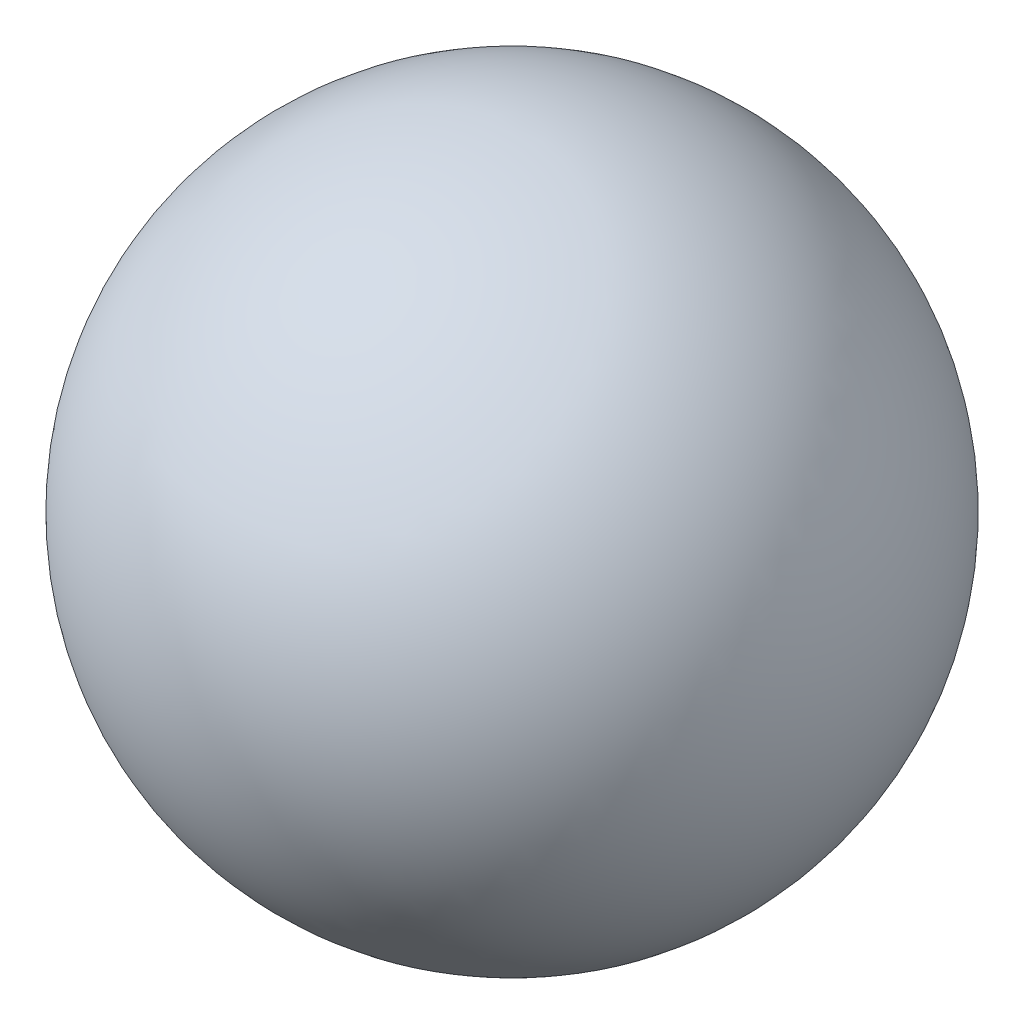
ISO-10303-21;
HEADER;
FILE_DESCRIPTION(('STEP AP214'),'2;1');
FILE_NAME('part.step','',(''),(''),'','','');
FILE_SCHEMA(('AUTOMOTIVE_DESIGN { 1 0 10303 214 1 1 1 1 }'));
ENDSEC;
DATA;
#1=APPLICATION_CONTEXT('core data for automotive mechanical design processes');
#2=APPLICATION_PROTOCOL_DEFINITION('international standard','automotive_design',2000,#1);
#3=PRODUCT_CONTEXT('',#1,'mechanical');
#4=PRODUCT('Part','Part','',(#3));
#5=PRODUCT_RELATED_PRODUCT_CATEGORY('part','',(#4));
#6=PRODUCT_DEFINITION_FORMATION('','',#4);
#7=PRODUCT_DEFINITION_CONTEXT('part definition',#1,'design');
#8=PRODUCT_DEFINITION('design','',#6,#7);
#9=PRODUCT_DEFINITION_SHAPE('','',#8);
#10=(LENGTH_UNIT() NAMED_UNIT(*) SI_UNIT(.MILLI.,.METRE.));
#11=(NAMED_UNIT(*) PLANE_ANGLE_UNIT() SI_UNIT($,.RADIAN.));
#12=(NAMED_UNIT(*) SI_UNIT($,.STERADIAN.) SOLID_ANGLE_UNIT());
#13=UNCERTAINTY_MEASURE_WITH_UNIT(LENGTH_MEASURE(1.E-05),#10,'distance_accuracy_value','');
#14=(GEOMETRIC_REPRESENTATION_CONTEXT(3) GLOBAL_UNCERTAINTY_ASSIGNED_CONTEXT((#13)) GLOBAL_UNIT_ASSIGNED_CONTEXT((#10,
#11,#12)) REPRESENTATION_CONTEXT('',''));
#15=CARTESIAN_POINT('',(0.,0.,0.));
#16=DIRECTION('',(0.,0.,1.));
#17=DIRECTION('',(1.,0.,0.));
#18=AXIS2_PLACEMENT_3D('',#15,#16,#17);
#19=CARTESIAN_POINT('',(0.,0.,0.));
#20=DIRECTION('',(0.,1.,0.));
#21=DIRECTION('',(1.,0.,0.));
#22=AXIS2_PLACEMENT_3D('',#19,#20,#21);
#23=SPHERICAL_SURFACE('',#22,1.6);
#24=CARTESIAN_POINT('',(0.,1.6,0.));
#25=VERTEX_POINT('',#24);
#26=VERTEX_LOOP('',#25);
#27=FACE_BOUND('',#26,.T.);
#28=ADVANCED_FACE('F33',(#27),#23,.T.);
#29=CLOSED_SHELL('',(#28));
#30=MANIFOLD_SOLID_BREP('B2',#29);
#31=ADVANCED_BREP_SHAPE_REPRESENTATION('',(#18,#30),#14);
#32=SHAPE_DEFINITION_REPRESENTATION(#9,#31);
ENDSEC;
END-ISO-10303-21;
